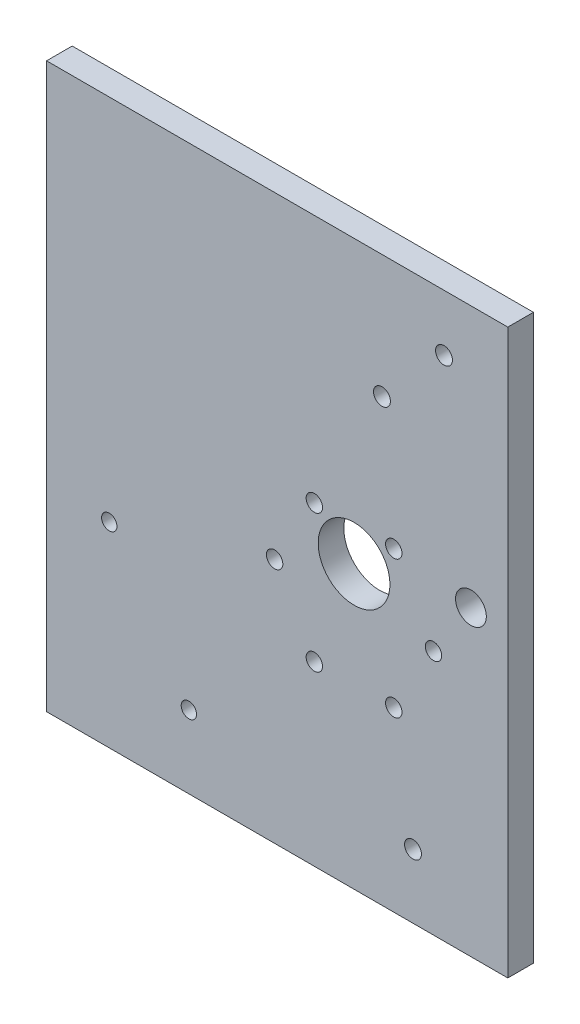
ISO-10303-21;
HEADER;
FILE_DESCRIPTION(('STEP AP214'),'2;1');
FILE_NAME('part.step','',(''),(''),'','','');
FILE_SCHEMA(('AUTOMOTIVE_DESIGN { 1 0 10303 214 1 1 1 1 }'));
ENDSEC;
DATA;
#1=APPLICATION_CONTEXT('core data for automotive mechanical design processes');
#2=APPLICATION_PROTOCOL_DEFINITION('international standard','automotive_design',2000,#1);
#3=PRODUCT_CONTEXT('',#1,'mechanical');
#4=PRODUCT('Part','Part','',(#3));
#5=PRODUCT_RELATED_PRODUCT_CATEGORY('part','',(#4));
#6=PRODUCT_DEFINITION_FORMATION('','',#4);
#7=PRODUCT_DEFINITION_CONTEXT('part definition',#1,'design');
#8=PRODUCT_DEFINITION('design','',#6,#7);
#9=PRODUCT_DEFINITION_SHAPE('','',#8);
#10=(LENGTH_UNIT() NAMED_UNIT(*) SI_UNIT(.MILLI.,.METRE.));
#11=(NAMED_UNIT(*) PLANE_ANGLE_UNIT() SI_UNIT($,.RADIAN.));
#12=(NAMED_UNIT(*) SI_UNIT($,.STERADIAN.) SOLID_ANGLE_UNIT());
#13=UNCERTAINTY_MEASURE_WITH_UNIT(LENGTH_MEASURE(1.E-05),#10,'distance_accuracy_value','');
#14=(GEOMETRIC_REPRESENTATION_CONTEXT(3) GLOBAL_UNCERTAINTY_ASSIGNED_CONTEXT((#13)) GLOBAL_UNIT_ASSIGNED_CONTEXT((#10,
#11,#12)) REPRESENTATION_CONTEXT('',''));
#15=CARTESIAN_POINT('',(0.,0.,0.));
#16=DIRECTION('',(0.,0.,1.));
#17=DIRECTION('',(1.,0.,0.));
#18=AXIS2_PLACEMENT_3D('',#15,#16,#17);
#19=CARTESIAN_POINT('',(0.,0.,5.));
#20=DIRECTION('',(0.,0.,-1.));
#21=DIRECTION('',(-1.,0.,0.));
#22=AXIS2_PLACEMENT_3D('',#19,#20,#21);
#23=PLANE('',#22);
#24=CARTESIAN_POINT('',(17.5517241379311,50.9999999999998,5.));
#25=DIRECTION('',(0.,0.,-1.));
#26=DIRECTION('',(-1.,0.,0.));
#27=AXIS2_PLACEMENT_3D('',#24,#25,#26);
#28=CIRCLE('',#27,1.65);
#29=CARTESIAN_POINT('',(15.9017241379311,50.9999999999998,5.));
#30=VERTEX_POINT('',#29);
#31=EDGE_CURVE('E374',#30,#30,#28,.T.);
#32=ORIENTED_EDGE('',*,*,#31,.T.);
#33=EDGE_LOOP('',(#32));
#34=FACE_BOUND('',#33,.T.);
#35=CARTESIAN_POINT('',(11.5000000000001,-35.4999999999996,5.));
#36=DIRECTION('',(0.,0.,-1.));
#37=DIRECTION('',(-1.,0.,0.));
#38=AXIS2_PLACEMENT_3D('',#35,#36,#37);
#39=CIRCLE('',#38,1.65);
#40=CARTESIAN_POINT('',(9.85000000000015,-35.4999999999996,5.));
#41=VERTEX_POINT('',#40);
#42=EDGE_CURVE('E375',#41,#41,#39,.T.);
#43=ORIENTED_EDGE('',*,*,#42,.T.);
#44=EDGE_LOOP('',(#43));
#45=FACE_BOUND('',#44,.T.);
#46=CARTESIAN_POINT('',(-47.7653149266618,-9.8199999999997,5.));
#47=DIRECTION('',(0.,0.,-1.));
#48=DIRECTION('',(-1.,0.,0.));
#49=AXIS2_PLACEMENT_3D('',#46,#47,#48);
#50=CIRCLE('',#49,1.5);
#51=CARTESIAN_POINT('',(-49.2653149266618,-9.8199999999997,5.));
#52=VERTEX_POINT('',#51);
#53=EDGE_CURVE('E379',#52,#52,#50,.T.);
#54=ORIENTED_EDGE('',*,*,#53,.T.);
#55=EDGE_LOOP('',(#54));
#56=FACE_BOUND('',#55,.T.);
#57=CARTESIAN_POINT('',(-32.23468507334,-33.8199999999998,5.));
#58=DIRECTION('',(0.,0.,-1.));
#59=DIRECTION('',(-1.,0.,0.));
#60=AXIS2_PLACEMENT_3D('',#57,#58,#59);
#61=CIRCLE('',#60,1.5);
#62=CARTESIAN_POINT('',(-33.73468507334,-33.8199999999998,5.));
#63=VERTEX_POINT('',#62);
#64=EDGE_CURVE('E384',#63,#63,#61,.T.);
#65=ORIENTED_EDGE('',*,*,#64,.T.);
#66=EDGE_LOOP('',(#65));
#67=FACE_BOUND('',#66,.T.);
#68=CARTESIAN_POINT('',(5.44827586206901,37.9999999999998,5.));
#69=DIRECTION('',(0.,0.,-1.));
#70=DIRECTION('',(-1.,0.,0.));
#71=AXIS2_PLACEMENT_3D('',#68,#69,#70);
#72=CIRCLE('',#71,1.65);
#73=CARTESIAN_POINT('',(3.79827586206901,37.9999999999998,5.));
#74=VERTEX_POINT('',#73);
#75=EDGE_CURVE('E387',#74,#74,#72,.T.);
#76=ORIENTED_EDGE('',*,*,#75,.T.);
#77=EDGE_LOOP('',(#76));
#78=FACE_BOUND('',#77,.T.);
#79=CARTESIAN_POINT('',(22.8078514495493,10.9896179967288,5.));
#80=DIRECTION('',(0.,0.,1.));
#81=DIRECTION('',(1.,0.,0.));
#82=AXIS2_PLACEMENT_3D('',#79,#80,#81);
#83=CIRCLE('',#82,3.00431930331363);
#84=CARTESIAN_POINT('',(25.812170752863,10.9896179967288,5.));
#85=VERTEX_POINT('',#84);
#86=EDGE_CURVE('E142',#85,#85,#83,.T.);
#87=ORIENTED_EDGE('',*,*,#86,.F.);
#88=EDGE_LOOP('',(#87));
#89=FACE_BOUND('',#88,.T.);
#90=DIRECTION('',(1.,0.,0.));
#91=VECTOR('',#90,1.);
#92=CARTESIAN_POINT('',(-60.,-48.,5.));
#93=LINE('',#92,#91);
#94=CARTESIAN_POINT('',(-60.,-48.,5.));
#95=VERTEX_POINT('',#94);
#96=CARTESIAN_POINT('',(30.,-48.,5.));
#97=VERTEX_POINT('',#96);
#98=EDGE_CURVE('E84',#95,#97,#93,.T.);
#99=ORIENTED_EDGE('',*,*,#98,.T.);
#100=DIRECTION('',(0.,1.,0.));
#101=VECTOR('',#100,1.);
#102=CARTESIAN_POINT('',(30.,62.,5.));
#103=LINE('',#102,#101);
#104=CARTESIAN_POINT('',(30.,62.,5.));
#105=VERTEX_POINT('',#104);
#106=EDGE_CURVE('E87',#97,#105,#103,.T.);
#107=ORIENTED_EDGE('',*,*,#106,.T.);
#108=DIRECTION('',(-1.,0.,0.));
#109=VECTOR('',#108,1.);
#110=CARTESIAN_POINT('',(30.,62.,5.));
#111=LINE('',#110,#109);
#112=CARTESIAN_POINT('',(-60.,62.,5.));
#113=VERTEX_POINT('',#112);
#114=EDGE_CURVE('E91',#105,#113,#111,.T.);
#115=ORIENTED_EDGE('',*,*,#114,.T.);
#116=DIRECTION('',(0.,-1.,0.));
#117=VECTOR('',#116,1.);
#118=CARTESIAN_POINT('',(-60.,62.,5.));
#119=LINE('',#118,#117);
#120=EDGE_CURVE('E56',#113,#95,#119,.T.);
#121=ORIENTED_EDGE('',*,*,#120,.T.);
#122=EDGE_LOOP('',(#99,#107,#115,#121));
#123=FACE_BOUND('',#122,.T.);
#124=CARTESIAN_POINT('',(-15.5,0.,5.));
#125=DIRECTION('',(0.,0.,1.));
#126=DIRECTION('',(1.,0.,0.));
#127=AXIS2_PLACEMENT_3D('',#124,#125,#126);
#128=CIRCLE('',#127,1.6);
#129=CARTESIAN_POINT('',(-13.9,0.,5.));
#130=VERTEX_POINT('',#129);
#131=EDGE_CURVE('E106',#130,#130,#128,.T.);
#132=ORIENTED_EDGE('',*,*,#131,.F.);
#133=EDGE_LOOP('',(#132));
#134=FACE_BOUND('',#133,.T.);
#135=CARTESIAN_POINT('',(0.,7.,5.));
#136=DIRECTION('',(0.,0.,1.));
#137=DIRECTION('',(1.,0.,0.));
#138=AXIS2_PLACEMENT_3D('',#135,#136,#137);
#139=CIRCLE('',#138,7.);
#140=CARTESIAN_POINT('',(7.,7.,5.));
#141=VERTEX_POINT('',#140);
#142=EDGE_CURVE('E165',#141,#141,#139,.T.);
#143=ORIENTED_EDGE('',*,*,#142,.F.);
#144=EDGE_LOOP('',(#143));
#145=FACE_BOUND('',#144,.T.);
#146=CARTESIAN_POINT('',(-7.74999999999995,13.4233937586588,5.));
#147=DIRECTION('',(0.,0.,1.));
#148=DIRECTION('',(1.,0.,0.));
#149=AXIS2_PLACEMENT_3D('',#146,#147,#148);
#150=CIRCLE('',#149,1.6);
#151=CARTESIAN_POINT('',(-6.14999999999995,13.4233937586588,5.));
#152=VERTEX_POINT('',#151);
#153=EDGE_CURVE('E160',#152,#152,#150,.T.);
#154=ORIENTED_EDGE('',*,*,#153,.F.);
#155=EDGE_LOOP('',(#154));
#156=FACE_BOUND('',#155,.T.);
#157=CARTESIAN_POINT('',(7.75000000000005,13.4233937586587,5.));
#158=DIRECTION('',(0.,0.,1.));
#159=DIRECTION('',(1.,0.,0.));
#160=AXIS2_PLACEMENT_3D('',#157,#158,#159);
#161=CIRCLE('',#160,1.6);
#162=CARTESIAN_POINT('',(9.35000000000005,13.4233937586587,5.));
#163=VERTEX_POINT('',#162);
#164=EDGE_CURVE('E155',#163,#163,#161,.T.);
#165=ORIENTED_EDGE('',*,*,#164,.F.);
#166=EDGE_LOOP('',(#165));
#167=FACE_BOUND('',#166,.T.);
#168=CARTESIAN_POINT('',(15.5,-1.08235921504137E-13,5.));
#169=DIRECTION('',(0.,0.,1.));
#170=DIRECTION('',(1.,0.,0.));
#171=AXIS2_PLACEMENT_3D('',#168,#169,#170);
#172=CIRCLE('',#171,1.6);
#173=CARTESIAN_POINT('',(17.1,-1.08235921504137E-13,5.));
#174=VERTEX_POINT('',#173);
#175=EDGE_CURVE('E150',#174,#174,#172,.T.);
#176=ORIENTED_EDGE('',*,*,#175,.F.);
#177=EDGE_LOOP('',(#176));
#178=FACE_BOUND('',#177,.T.);
#179=CARTESIAN_POINT('',(7.74999999999986,-13.4233937586588,5.));
#180=DIRECTION('',(0.,0.,1.));
#181=DIRECTION('',(1.,0.,0.));
#182=AXIS2_PLACEMENT_3D('',#179,#180,#181);
#183=CIRCLE('',#182,1.6);
#184=CARTESIAN_POINT('',(9.34999999999986,-13.4233937586588,5.));
#185=VERTEX_POINT('',#184);
#186=EDGE_CURVE('E145',#185,#185,#183,.T.);
#187=ORIENTED_EDGE('',*,*,#186,.F.);
#188=EDGE_LOOP('',(#187));
#189=FACE_BOUND('',#188,.T.);
#190=CARTESIAN_POINT('',(-7.75000000000014,-13.4233937586587,5.));
#191=DIRECTION('',(0.,0.,1.));
#192=DIRECTION('',(1.,0.,0.));
#193=AXIS2_PLACEMENT_3D('',#190,#191,#192);
#194=CIRCLE('',#193,1.6);
#195=CARTESIAN_POINT('',(-6.15000000000014,-13.4233937586587,5.));
#196=VERTEX_POINT('',#195);
#197=EDGE_CURVE('E136',#196,#196,#194,.T.);
#198=ORIENTED_EDGE('',*,*,#197,.F.);
#199=EDGE_LOOP('',(#198));
#200=FACE_BOUND('',#199,.T.);
#201=ADVANCED_FACE('F38',(#34,#45,#56,#67,#78,#89,#123,#134,#145,#156,#167,#178,#189,#200),#23,.F.);
#202=CARTESIAN_POINT('',(0.,0.,0.));
#203=DIRECTION('',(0.,0.,-1.));
#204=DIRECTION('',(-1.,0.,0.));
#205=AXIS2_PLACEMENT_3D('',#202,#203,#204);
#206=PLANE('',#205);
#207=CARTESIAN_POINT('',(17.5517241379311,50.9999999999998,0.));
#208=DIRECTION('',(0.,0.,-1.));
#209=DIRECTION('',(-1.,0.,0.));
#210=AXIS2_PLACEMENT_3D('',#207,#208,#209);
#211=CIRCLE('',#210,1.65);
#212=CARTESIAN_POINT('',(15.9017241379311,50.9999999999998,0.));
#213=VERTEX_POINT('',#212);
#214=EDGE_CURVE('E371',#213,#213,#211,.T.);
#215=ORIENTED_EDGE('',*,*,#214,.F.);
#216=EDGE_LOOP('',(#215));
#217=FACE_BOUND('',#216,.T.);
#218=CARTESIAN_POINT('',(11.5000000000001,-35.4999999999996,0.));
#219=DIRECTION('',(0.,0.,-1.));
#220=DIRECTION('',(-1.,0.,0.));
#221=AXIS2_PLACEMENT_3D('',#218,#219,#220);
#222=CIRCLE('',#221,1.65);
#223=CARTESIAN_POINT('',(9.85000000000015,-35.4999999999996,0.));
#224=VERTEX_POINT('',#223);
#225=EDGE_CURVE('E397',#224,#224,#222,.T.);
#226=ORIENTED_EDGE('',*,*,#225,.F.);
#227=EDGE_LOOP('',(#226));
#228=FACE_BOUND('',#227,.T.);
#229=CARTESIAN_POINT('',(-47.7653149266618,-9.8199999999997,0.));
#230=DIRECTION('',(0.,0.,-1.));
#231=DIRECTION('',(-1.,0.,0.));
#232=AXIS2_PLACEMENT_3D('',#229,#230,#231);
#233=CIRCLE('',#232,1.5);
#234=CARTESIAN_POINT('',(-49.2653149266618,-9.8199999999997,0.));
#235=VERTEX_POINT('',#234);
#236=EDGE_CURVE('E394',#235,#235,#233,.T.);
#237=ORIENTED_EDGE('',*,*,#236,.F.);
#238=EDGE_LOOP('',(#237));
#239=FACE_BOUND('',#238,.T.);
#240=CARTESIAN_POINT('',(-32.23468507334,-33.8199999999998,0.));
#241=DIRECTION('',(0.,0.,-1.));
#242=DIRECTION('',(-1.,0.,0.));
#243=AXIS2_PLACEMENT_3D('',#240,#241,#242);
#244=CIRCLE('',#243,1.5);
#245=CARTESIAN_POINT('',(-33.73468507334,-33.8199999999998,0.));
#246=VERTEX_POINT('',#245);
#247=EDGE_CURVE('E390',#246,#246,#244,.T.);
#248=ORIENTED_EDGE('',*,*,#247,.F.);
#249=EDGE_LOOP('',(#248));
#250=FACE_BOUND('',#249,.T.);
#251=CARTESIAN_POINT('',(5.44827586206901,37.9999999999998,0.));
#252=DIRECTION('',(0.,0.,-1.));
#253=DIRECTION('',(-1.,0.,0.));
#254=AXIS2_PLACEMENT_3D('',#251,#252,#253);
#255=CIRCLE('',#254,1.65);
#256=CARTESIAN_POINT('',(3.79827586206901,37.9999999999998,0.));
#257=VERTEX_POINT('',#256);
#258=EDGE_CURVE('E393',#257,#257,#255,.T.);
#259=ORIENTED_EDGE('',*,*,#258,.F.);
#260=EDGE_LOOP('',(#259));
#261=FACE_BOUND('',#260,.T.);
#262=CARTESIAN_POINT('',(22.8078514495493,10.9896179967288,0.));
#263=DIRECTION('',(0.,0.,-1.));
#264=DIRECTION('',(-1.,0.,0.));
#265=AXIS2_PLACEMENT_3D('',#262,#263,#264);
#266=CIRCLE('',#265,3.00431930331363);
#267=CARTESIAN_POINT('',(19.8035321462357,10.9896179967288,0.));
#268=VERTEX_POINT('',#267);
#269=EDGE_CURVE('E42',#268,#268,#266,.T.);
#270=ORIENTED_EDGE('',*,*,#269,.F.);
#271=EDGE_LOOP('',(#270));
#272=FACE_BOUND('',#271,.T.);
#273=CARTESIAN_POINT('',(7.74999999999986,-13.4233937586588,0.));
#274=DIRECTION('',(0.,0.,1.));
#275=DIRECTION('',(1.,0.,0.));
#276=AXIS2_PLACEMENT_3D('',#273,#274,#275);
#277=CIRCLE('',#276,1.6);
#278=CARTESIAN_POINT('',(9.34999999999986,-13.4233937586588,0.));
#279=VERTEX_POINT('',#278);
#280=EDGE_CURVE('E139',#279,#279,#277,.T.);
#281=ORIENTED_EDGE('',*,*,#280,.T.);
#282=EDGE_LOOP('',(#281));
#283=FACE_BOUND('',#282,.T.);
#284=CARTESIAN_POINT('',(7.75000000000005,13.4233937586587,0.));
#285=DIRECTION('',(0.,0.,1.));
#286=DIRECTION('',(1.,0.,0.));
#287=AXIS2_PLACEMENT_3D('',#284,#285,#286);
#288=CIRCLE('',#287,1.6);
#289=CARTESIAN_POINT('',(9.35000000000005,13.4233937586587,0.));
#290=VERTEX_POINT('',#289);
#291=EDGE_CURVE('E153',#290,#290,#288,.T.);
#292=ORIENTED_EDGE('',*,*,#291,.T.);
#293=EDGE_LOOP('',(#292));
#294=FACE_BOUND('',#293,.T.);
#295=CARTESIAN_POINT('',(0.,7.,0.));
#296=DIRECTION('',(0.,0.,1.));
#297=DIRECTION('',(1.,0.,0.));
#298=AXIS2_PLACEMENT_3D('',#295,#296,#297);
#299=CIRCLE('',#298,7.);
#300=CARTESIAN_POINT('',(7.,7.,0.));
#301=VERTEX_POINT('',#300);
#302=EDGE_CURVE('E163',#301,#301,#299,.T.);
#303=ORIENTED_EDGE('',*,*,#302,.T.);
#304=EDGE_LOOP('',(#303));
#305=FACE_BOUND('',#304,.T.);
#306=DIRECTION('',(1.,0.,0.));
#307=VECTOR('',#306,1.);
#308=CARTESIAN_POINT('',(30.,-48.,0.));
#309=LINE('',#308,#307);
#310=CARTESIAN_POINT('',(-60.,-48.,0.));
#311=VERTEX_POINT('',#310);
#312=CARTESIAN_POINT('',(30.,-48.,0.));
#313=VERTEX_POINT('',#312);
#314=EDGE_CURVE('E79',#311,#313,#309,.T.);
#315=ORIENTED_EDGE('',*,*,#314,.F.);
#316=DIRECTION('',(0.,-1.,0.));
#317=VECTOR('',#316,1.);
#318=CARTESIAN_POINT('',(-60.,62.,0.));
#319=LINE('',#318,#317);
#320=CARTESIAN_POINT('',(-60.,62.,0.));
#321=VERTEX_POINT('',#320);
#322=EDGE_CURVE('E109',#321,#311,#319,.T.);
#323=ORIENTED_EDGE('',*,*,#322,.F.);
#324=DIRECTION('',(-1.,0.,0.));
#325=VECTOR('',#324,1.);
#326=CARTESIAN_POINT('',(-25.,62.,0.));
#327=LINE('',#326,#325);
#328=CARTESIAN_POINT('',(30.,62.,0.));
#329=VERTEX_POINT('',#328);
#330=EDGE_CURVE('E72',#329,#321,#327,.T.);
#331=ORIENTED_EDGE('',*,*,#330,.F.);
#332=DIRECTION('',(0.,1.,0.));
#333=VECTOR('',#332,1.);
#334=CARTESIAN_POINT('',(30.,62.,0.));
#335=LINE('',#334,#333);
#336=EDGE_CURVE('E96',#313,#329,#335,.T.);
#337=ORIENTED_EDGE('',*,*,#336,.F.);
#338=EDGE_LOOP('',(#315,#323,#331,#337));
#339=FACE_BOUND('',#338,.T.);
#340=CARTESIAN_POINT('',(-15.5,0.,0.));
#341=DIRECTION('',(0.,0.,1.));
#342=DIRECTION('',(1.,0.,0.));
#343=AXIS2_PLACEMENT_3D('',#340,#341,#342);
#344=CIRCLE('',#343,1.6);
#345=CARTESIAN_POINT('',(-13.9,0.,0.));
#346=VERTEX_POINT('',#345);
#347=EDGE_CURVE('E123',#346,#346,#344,.T.);
#348=ORIENTED_EDGE('',*,*,#347,.T.);
#349=EDGE_LOOP('',(#348));
#350=FACE_BOUND('',#349,.T.);
#351=CARTESIAN_POINT('',(-7.74999999999995,13.4233937586588,0.));
#352=DIRECTION('',(0.,0.,1.));
#353=DIRECTION('',(1.,0.,0.));
#354=AXIS2_PLACEMENT_3D('',#351,#352,#353);
#355=CIRCLE('',#354,1.6);
#356=CARTESIAN_POINT('',(-6.14999999999995,13.4233937586588,0.));
#357=VERTEX_POINT('',#356);
#358=EDGE_CURVE('E127',#357,#357,#355,.T.);
#359=ORIENTED_EDGE('',*,*,#358,.T.);
#360=EDGE_LOOP('',(#359));
#361=FACE_BOUND('',#360,.T.);
#362=CARTESIAN_POINT('',(15.5,-1.08235921504137E-13,0.));
#363=DIRECTION('',(0.,0.,1.));
#364=DIRECTION('',(1.,0.,0.));
#365=AXIS2_PLACEMENT_3D('',#362,#363,#364);
#366=CIRCLE('',#365,1.6);
#367=CARTESIAN_POINT('',(17.1,-1.08235921504137E-13,0.));
#368=VERTEX_POINT('',#367);
#369=EDGE_CURVE('E131',#368,#368,#366,.T.);
#370=ORIENTED_EDGE('',*,*,#369,.T.);
#371=EDGE_LOOP('',(#370));
#372=FACE_BOUND('',#371,.T.);
#373=CARTESIAN_POINT('',(-7.75000000000014,-13.4233937586587,0.));
#374=DIRECTION('',(0.,0.,1.));
#375=DIRECTION('',(1.,0.,0.));
#376=AXIS2_PLACEMENT_3D('',#373,#374,#375);
#377=CIRCLE('',#376,1.6);
#378=CARTESIAN_POINT('',(-6.15000000000014,-13.4233937586587,0.));
#379=VERTEX_POINT('',#378);
#380=EDGE_CURVE('E134',#379,#379,#377,.T.);
#381=ORIENTED_EDGE('',*,*,#380,.T.);
#382=EDGE_LOOP('',(#381));
#383=FACE_BOUND('',#382,.T.);
#384=ADVANCED_FACE('F115',(#217,#228,#239,#250,#261,#272,#283,#294,#305,#339,#350,#361,#372,
#383),#206,.T.);
#385=CARTESIAN_POINT('',(30.,-48.,5.));
#386=DIRECTION('',(0.,1.,0.));
#387=DIRECTION('',(-1.,0.,0.));
#388=AXIS2_PLACEMENT_3D('',#385,#386,#387);
#389=PLANE('',#388);
#390=ORIENTED_EDGE('',*,*,#314,.T.);
#391=DIRECTION('',(0.,0.,-1.));
#392=VECTOR('',#391,1.);
#393=CARTESIAN_POINT('',(30.,-48.,5.));
#394=LINE('',#393,#392);
#395=EDGE_CURVE('E11',#97,#313,#394,.T.);
#396=ORIENTED_EDGE('',*,*,#395,.F.);
#397=ORIENTED_EDGE('',*,*,#98,.F.);
#398=DIRECTION('',(0.,0.,-1.));
#399=VECTOR('',#398,1.);
#400=CARTESIAN_POINT('',(-60.,-48.,5.));
#401=LINE('',#400,#399);
#402=EDGE_CURVE('E101',#95,#311,#401,.T.);
#403=ORIENTED_EDGE('',*,*,#402,.T.);
#404=EDGE_LOOP('',(#390,#396,#397,#403));
#405=FACE_BOUND('',#404,.T.);
#406=ADVANCED_FACE('F40',(#405),#389,.F.);
#407=CARTESIAN_POINT('',(30.,62.,5.));
#408=DIRECTION('',(-1.,0.,0.));
#409=DIRECTION('',(0.,-1.,0.));
#410=AXIS2_PLACEMENT_3D('',#407,#408,#409);
#411=PLANE('',#410);
#412=ORIENTED_EDGE('',*,*,#336,.T.);
#413=DIRECTION('',(0.,0.,-1.));
#414=VECTOR('',#413,1.);
#415=CARTESIAN_POINT('',(30.,62.,5.));
#416=LINE('',#415,#414);
#417=EDGE_CURVE('E48',#105,#329,#416,.T.);
#418=ORIENTED_EDGE('',*,*,#417,.F.);
#419=ORIENTED_EDGE('',*,*,#106,.F.);
#420=ORIENTED_EDGE('',*,*,#395,.T.);
#421=EDGE_LOOP('',(#412,#418,#419,#420));
#422=FACE_BOUND('',#421,.T.);
#423=ADVANCED_FACE('F95',(#422),#411,.F.);
#424=CARTESIAN_POINT('',(-25.,62.,5.));
#425=DIRECTION('',(0.,-1.,0.));
#426=DIRECTION('',(1.,0.,0.));
#427=AXIS2_PLACEMENT_3D('',#424,#425,#426);
#428=PLANE('',#427);
#429=ORIENTED_EDGE('',*,*,#330,.T.);
#430=DIRECTION('',(0.,0.,-1.));
#431=VECTOR('',#430,1.);
#432=CARTESIAN_POINT('',(-60.,62.,5.));
#433=LINE('',#432,#431);
#434=EDGE_CURVE('E97',#113,#321,#433,.T.);
#435=ORIENTED_EDGE('',*,*,#434,.F.);
#436=ORIENTED_EDGE('',*,*,#114,.F.);
#437=ORIENTED_EDGE('',*,*,#417,.T.);
#438=EDGE_LOOP('',(#429,#435,#436,#437));
#439=FACE_BOUND('',#438,.T.);
#440=ADVANCED_FACE('F99',(#439),#428,.F.);
#441=CARTESIAN_POINT('',(-60.,62.,5.));
#442=DIRECTION('',(1.,0.,0.));
#443=DIRECTION('',(0.,1.,0.));
#444=AXIS2_PLACEMENT_3D('',#441,#442,#443);
#445=PLANE('',#444);
#446=ORIENTED_EDGE('',*,*,#322,.T.);
#447=ORIENTED_EDGE('',*,*,#402,.F.);
#448=ORIENTED_EDGE('',*,*,#120,.F.);
#449=ORIENTED_EDGE('',*,*,#434,.T.);
#450=EDGE_LOOP('',(#446,#447,#448,#449));
#451=FACE_BOUND('',#450,.T.);
#452=ADVANCED_FACE('F114',(#451),#445,.F.);
#453=CARTESIAN_POINT('',(-15.5,0.,5.));
#454=DIRECTION('',(0.,0.,-1.));
#455=DIRECTION('',(-1.,0.,0.));
#456=AXIS2_PLACEMENT_3D('',#453,#454,#455);
#457=CYLINDRICAL_SURFACE('',#456,1.6);
#458=ORIENTED_EDGE('',*,*,#131,.T.);
#459=EDGE_LOOP('',(#458));
#460=FACE_BOUND('',#459,.T.);
#461=ORIENTED_EDGE('',*,*,#347,.F.);
#462=EDGE_LOOP('',(#461));
#463=FACE_BOUND('',#462,.T.);
#464=ADVANCED_FACE('F174',(#460,#463),#457,.F.);
#465=CARTESIAN_POINT('',(0.,7.,5.));
#466=DIRECTION('',(0.,0.,-1.));
#467=DIRECTION('',(-1.,0.,0.));
#468=AXIS2_PLACEMENT_3D('',#465,#466,#467);
#469=CYLINDRICAL_SURFACE('',#468,7.);
#470=ORIENTED_EDGE('',*,*,#142,.T.);
#471=EDGE_LOOP('',(#470));
#472=FACE_BOUND('',#471,.T.);
#473=ORIENTED_EDGE('',*,*,#302,.F.);
#474=EDGE_LOOP('',(#473));
#475=FACE_BOUND('',#474,.T.);
#476=ADVANCED_FACE('F219',(#472,#475),#469,.F.);
#477=CARTESIAN_POINT('',(-7.74999999999995,13.4233937586588,5.));
#478=DIRECTION('',(0.,0.,-1.));
#479=DIRECTION('',(-1.,0.,0.));
#480=AXIS2_PLACEMENT_3D('',#477,#478,#479);
#481=CYLINDRICAL_SURFACE('',#480,1.6);
#482=ORIENTED_EDGE('',*,*,#153,.T.);
#483=EDGE_LOOP('',(#482));
#484=FACE_BOUND('',#483,.T.);
#485=ORIENTED_EDGE('',*,*,#358,.F.);
#486=EDGE_LOOP('',(#485));
#487=FACE_BOUND('',#486,.T.);
#488=ADVANCED_FACE('F215',(#484,#487),#481,.F.);
#489=CARTESIAN_POINT('',(7.75000000000005,13.4233937586587,5.));
#490=DIRECTION('',(0.,0.,-1.));
#491=DIRECTION('',(-1.,0.,0.));
#492=AXIS2_PLACEMENT_3D('',#489,#490,#491);
#493=CYLINDRICAL_SURFACE('',#492,1.6);
#494=ORIENTED_EDGE('',*,*,#164,.T.);
#495=EDGE_LOOP('',(#494));
#496=FACE_BOUND('',#495,.T.);
#497=ORIENTED_EDGE('',*,*,#291,.F.);
#498=EDGE_LOOP('',(#497));
#499=FACE_BOUND('',#498,.T.);
#500=ADVANCED_FACE('F211',(#496,#499),#493,.F.);
#501=CARTESIAN_POINT('',(15.5,-1.08235921504137E-13,5.));
#502=DIRECTION('',(0.,0.,-1.));
#503=DIRECTION('',(-1.,0.,0.));
#504=AXIS2_PLACEMENT_3D('',#501,#502,#503);
#505=CYLINDRICAL_SURFACE('',#504,1.6);
#506=ORIENTED_EDGE('',*,*,#175,.T.);
#507=EDGE_LOOP('',(#506));
#508=FACE_BOUND('',#507,.T.);
#509=ORIENTED_EDGE('',*,*,#369,.F.);
#510=EDGE_LOOP('',(#509));
#511=FACE_BOUND('',#510,.T.);
#512=ADVANCED_FACE('F204',(#508,#511),#505,.F.);
#513=CARTESIAN_POINT('',(7.74999999999986,-13.4233937586588,5.));
#514=DIRECTION('',(0.,0.,-1.));
#515=DIRECTION('',(-1.,0.,0.));
#516=AXIS2_PLACEMENT_3D('',#513,#514,#515);
#517=CYLINDRICAL_SURFACE('',#516,1.6);
#518=ORIENTED_EDGE('',*,*,#186,.T.);
#519=EDGE_LOOP('',(#518));
#520=FACE_BOUND('',#519,.T.);
#521=ORIENTED_EDGE('',*,*,#280,.F.);
#522=EDGE_LOOP('',(#521));
#523=FACE_BOUND('',#522,.T.);
#524=ADVANCED_FACE('F195',(#520,#523),#517,.F.);
#525=CARTESIAN_POINT('',(-7.75000000000014,-13.4233937586587,5.));
#526=DIRECTION('',(0.,0.,-1.));
#527=DIRECTION('',(-1.,0.,0.));
#528=AXIS2_PLACEMENT_3D('',#525,#526,#527);
#529=CYLINDRICAL_SURFACE('',#528,1.6);
#530=ORIENTED_EDGE('',*,*,#197,.T.);
#531=EDGE_LOOP('',(#530));
#532=FACE_BOUND('',#531,.T.);
#533=ORIENTED_EDGE('',*,*,#380,.F.);
#534=EDGE_LOOP('',(#533));
#535=FACE_BOUND('',#534,.T.);
#536=ADVANCED_FACE('F192',(#532,#535),#529,.F.);
#537=CARTESIAN_POINT('',(22.8078514495493,10.9896179967288,-5.));
#538=DIRECTION('',(0.,0.,1.));
#539=DIRECTION('',(1.,0.,0.));
#540=AXIS2_PLACEMENT_3D('',#537,#538,#539);
#541=CYLINDRICAL_SURFACE('',#540,3.00431930331363);
#542=ORIENTED_EDGE('',*,*,#269,.T.);
#543=EDGE_LOOP('',(#542));
#544=FACE_BOUND('',#543,.T.);
#545=ORIENTED_EDGE('',*,*,#86,.T.);
#546=EDGE_LOOP('',(#545));
#547=FACE_BOUND('',#546,.T.);
#548=ADVANCED_FACE('F194',(#544,#547),#541,.F.);
#549=CARTESIAN_POINT('',(5.44827586206901,37.9999999999998,10.));
#550=DIRECTION('',(0.,0.,-1.));
#551=DIRECTION('',(-1.,0.,0.));
#552=AXIS2_PLACEMENT_3D('',#549,#550,#551);
#553=CYLINDRICAL_SURFACE('',#552,1.65);
#554=ORIENTED_EDGE('',*,*,#258,.T.);
#555=EDGE_LOOP('',(#554));
#556=FACE_BOUND('',#555,.T.);
#557=ORIENTED_EDGE('',*,*,#75,.F.);
#558=EDGE_LOOP('',(#557));
#559=FACE_BOUND('',#558,.T.);
#560=ADVANCED_FACE('F201',(#556,#559),#553,.F.);
#561=CARTESIAN_POINT('',(-32.23468507334,-33.8199999999998,10.));
#562=DIRECTION('',(0.,0.,-1.));
#563=DIRECTION('',(-1.,0.,0.));
#564=AXIS2_PLACEMENT_3D('',#561,#562,#563);
#565=CYLINDRICAL_SURFACE('',#564,1.5);
#566=ORIENTED_EDGE('',*,*,#247,.T.);
#567=EDGE_LOOP('',(#566));
#568=FACE_BOUND('',#567,.T.);
#569=ORIENTED_EDGE('',*,*,#64,.F.);
#570=EDGE_LOOP('',(#569));
#571=FACE_BOUND('',#570,.T.);
#572=ADVANCED_FACE('F325',(#568,#571),#565,.F.);
#573=CARTESIAN_POINT('',(-47.7653149266618,-9.8199999999997,10.));
#574=DIRECTION('',(0.,0.,-1.));
#575=DIRECTION('',(-1.,0.,0.));
#576=AXIS2_PLACEMENT_3D('',#573,#574,#575);
#577=CYLINDRICAL_SURFACE('',#576,1.5);
#578=ORIENTED_EDGE('',*,*,#236,.T.);
#579=EDGE_LOOP('',(#578));
#580=FACE_BOUND('',#579,.T.);
#581=ORIENTED_EDGE('',*,*,#53,.F.);
#582=EDGE_LOOP('',(#581));
#583=FACE_BOUND('',#582,.T.);
#584=ADVANCED_FACE('F332',(#580,#583),#577,.F.);
#585=CARTESIAN_POINT('',(11.5000000000001,-35.4999999999996,10.));
#586=DIRECTION('',(0.,0.,-1.));
#587=DIRECTION('',(-1.,0.,0.));
#588=AXIS2_PLACEMENT_3D('',#585,#586,#587);
#589=CYLINDRICAL_SURFACE('',#588,1.65);
#590=ORIENTED_EDGE('',*,*,#225,.T.);
#591=EDGE_LOOP('',(#590));
#592=FACE_BOUND('',#591,.T.);
#593=ORIENTED_EDGE('',*,*,#42,.F.);
#594=EDGE_LOOP('',(#593));
#595=FACE_BOUND('',#594,.T.);
#596=ADVANCED_FACE('F339',(#592,#595),#589,.F.);
#597=CARTESIAN_POINT('',(17.5517241379311,50.9999999999998,10.));
#598=DIRECTION('',(0.,0.,-1.));
#599=DIRECTION('',(-1.,0.,0.));
#600=AXIS2_PLACEMENT_3D('',#597,#598,#599);
#601=CYLINDRICAL_SURFACE('',#600,1.65);
#602=ORIENTED_EDGE('',*,*,#214,.T.);
#603=EDGE_LOOP('',(#602));
#604=FACE_BOUND('',#603,.T.);
#605=ORIENTED_EDGE('',*,*,#31,.F.);
#606=EDGE_LOOP('',(#605));
#607=FACE_BOUND('',#606,.T.);
#608=ADVANCED_FACE('F347',(#604,#607),#601,.F.);
#609=CLOSED_SHELL('',(#201,#384,#406,#423,#440,#452,#464,#476,#488,#500,#512,#524,#536,#548,
#560,#572,#584,#596,#608));
#610=MANIFOLD_SOLID_BREP('B2',#609);
#611=ADVANCED_BREP_SHAPE_REPRESENTATION('',(#18,#610),#14);
#612=SHAPE_DEFINITION_REPRESENTATION(#9,#611);
ENDSEC;
END-ISO-10303-21;
